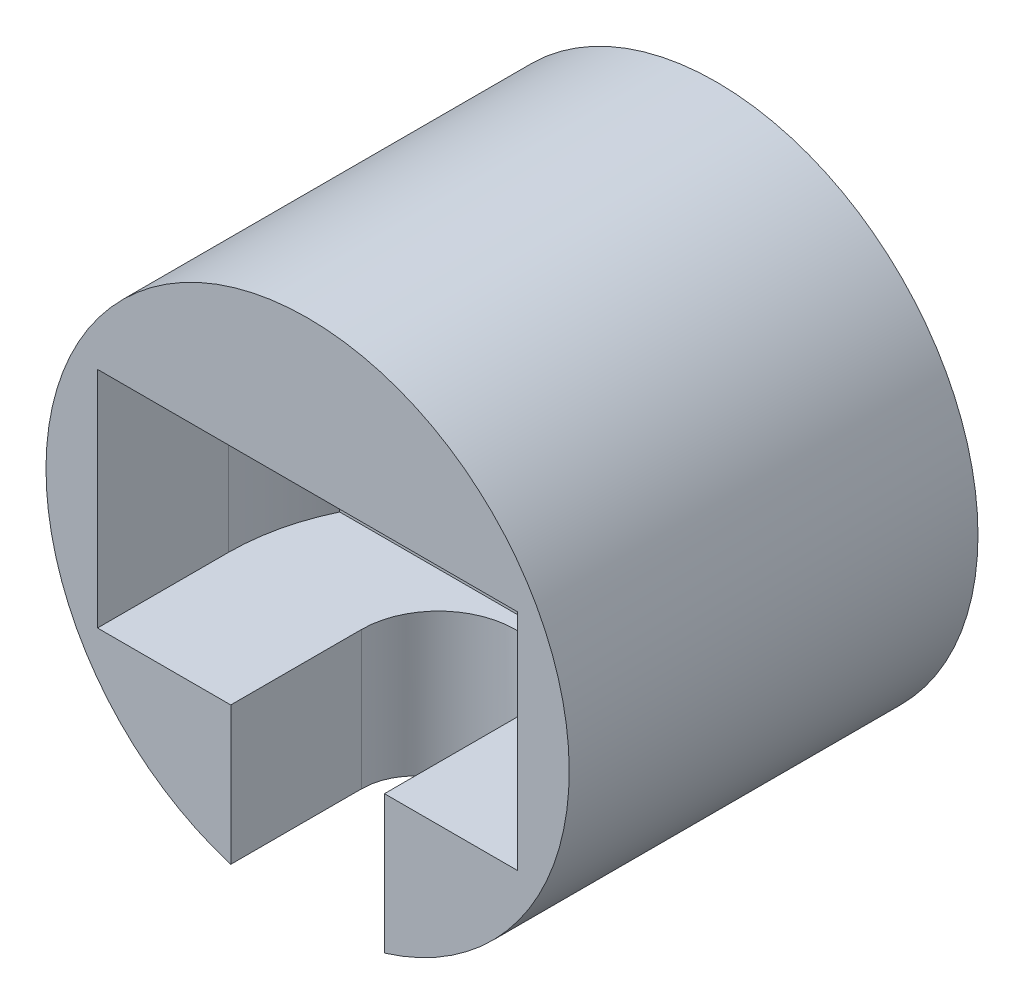
ISO-10303-21;
HEADER;
FILE_DESCRIPTION(('STEP AP214'),'2;1');
FILE_NAME('part.step','',(''),(''),'','','');
FILE_SCHEMA(('AUTOMOTIVE_DESIGN { 1 0 10303 214 1 1 1 1 }'));
ENDSEC;
DATA;
#1=APPLICATION_CONTEXT('core data for automotive mechanical design processes');
#2=APPLICATION_PROTOCOL_DEFINITION('international standard','automotive_design',2000,#1);
#3=PRODUCT_CONTEXT('',#1,'mechanical');
#4=PRODUCT('Part','Part','',(#3));
#5=PRODUCT_RELATED_PRODUCT_CATEGORY('part','',(#4));
#6=PRODUCT_DEFINITION_FORMATION('','',#4);
#7=PRODUCT_DEFINITION_CONTEXT('part definition',#1,'design');
#8=PRODUCT_DEFINITION('design','',#6,#7);
#9=PRODUCT_DEFINITION_SHAPE('','',#8);
#10=(LENGTH_UNIT() NAMED_UNIT(*) SI_UNIT(.MILLI.,.METRE.));
#11=(NAMED_UNIT(*) PLANE_ANGLE_UNIT() SI_UNIT($,.RADIAN.));
#12=(NAMED_UNIT(*) SI_UNIT($,.STERADIAN.) SOLID_ANGLE_UNIT());
#13=UNCERTAINTY_MEASURE_WITH_UNIT(LENGTH_MEASURE(1.E-05),#10,'distance_accuracy_value','');
#14=(GEOMETRIC_REPRESENTATION_CONTEXT(3) GLOBAL_UNCERTAINTY_ASSIGNED_CONTEXT((#13)) GLOBAL_UNIT_ASSIGNED_CONTEXT((#10,
#11,#12)) REPRESENTATION_CONTEXT('',''));
#15=CARTESIAN_POINT('',(0.,0.,0.));
#16=DIRECTION('',(0.,0.,1.));
#17=DIRECTION('',(1.,0.,0.));
#18=AXIS2_PLACEMENT_3D('',#15,#16,#17);
#19=CARTESIAN_POINT('',(0.,0.,25.));
#20=DIRECTION('',(0.,0.,1.));
#21=DIRECTION('',(1.,0.,0.));
#22=AXIS2_PLACEMENT_3D('',#19,#20,#21);
#23=PLANE('',#22);
#24=DIRECTION('',(0.,1.,0.));
#25=VECTOR('',#24,1.);
#26=CARTESIAN_POINT('',(4.7,-16.001,25.));
#27=LINE('',#26,#25);
#28=CARTESIAN_POINT('',(4.7,-15.2941165158371,25.));
#29=VERTEX_POINT('',#28);
#30=CARTESIAN_POINT('',(4.7,-6.85,25.));
#31=VERTEX_POINT('',#30);
#32=EDGE_CURVE('E128',#29,#31,#27,.T.);
#33=ORIENTED_EDGE('',*,*,#32,.F.);
#34=CARTESIAN_POINT('',(0.,0.,25.));
#35=DIRECTION('',(0.,0.,1.));
#36=DIRECTION('',(1.,0.,0.));
#37=AXIS2_PLACEMENT_3D('',#34,#35,#36);
#38=CIRCLE('',#37,16.);
#39=CARTESIAN_POINT('',(-4.7,-15.2941165158371,25.));
#40=VERTEX_POINT('',#39);
#41=EDGE_CURVE('E134',#29,#40,#38,.T.);
#42=ORIENTED_EDGE('',*,*,#41,.T.);
#43=DIRECTION('',(0.,1.,0.));
#44=VECTOR('',#43,1.);
#45=CARTESIAN_POINT('',(-4.7,-16.001,25.));
#46=LINE('',#45,#44);
#47=CARTESIAN_POINT('',(-4.7,-6.85,25.));
#48=VERTEX_POINT('',#47);
#49=EDGE_CURVE('E115',#40,#48,#46,.T.);
#50=ORIENTED_EDGE('',*,*,#49,.T.);
#51=DIRECTION('',(1.,0.,0.));
#52=VECTOR('',#51,1.);
#53=CARTESIAN_POINT('',(12.85,-6.85,25.));
#54=LINE('',#53,#52);
#55=CARTESIAN_POINT('',(-12.85,-6.85,25.));
#56=VERTEX_POINT('',#55);
#57=EDGE_CURVE('E168',#56,#48,#54,.T.);
#58=ORIENTED_EDGE('',*,*,#57,.F.);
#59=DIRECTION('',(0.,1.,0.));
#60=VECTOR('',#59,1.);
#61=CARTESIAN_POINT('',(-12.85,-6.85,25.));
#62=LINE('',#61,#60);
#63=CARTESIAN_POINT('',(-12.85,6.85,25.));
#64=VERTEX_POINT('',#63);
#65=EDGE_CURVE('E195',#56,#64,#62,.T.);
#66=ORIENTED_EDGE('',*,*,#65,.T.);
#67=DIRECTION('',(1.,0.,0.));
#68=VECTOR('',#67,1.);
#69=CARTESIAN_POINT('',(12.85,6.85,25.));
#70=LINE('',#69,#68);
#71=CARTESIAN_POINT('',(12.85,6.85,25.));
#72=VERTEX_POINT('',#71);
#73=EDGE_CURVE('E199',#64,#72,#70,.T.);
#74=ORIENTED_EDGE('',*,*,#73,.T.);
#75=DIRECTION('',(0.,1.,0.));
#76=VECTOR('',#75,1.);
#77=CARTESIAN_POINT('',(12.85,-6.85,25.));
#78=LINE('',#77,#76);
#79=CARTESIAN_POINT('',(12.85,-6.85,25.));
#80=VERTEX_POINT('',#79);
#81=EDGE_CURVE('E228',#80,#72,#78,.T.);
#82=ORIENTED_EDGE('',*,*,#81,.F.);
#83=EDGE_CURVE('E175',#31,#80,#54,.T.);
#84=ORIENTED_EDGE('',*,*,#83,.F.);
#85=EDGE_LOOP('',(#33,#42,#50,#58,#66,#74,#82,#84));
#86=FACE_BOUND('',#85,.T.);
#87=ADVANCED_FACE('F39',(#86),#23,.T.);
#88=CARTESIAN_POINT('',(0.,0.,0.));
#89=DIRECTION('',(0.,0.,1.));
#90=DIRECTION('',(1.,0.,0.));
#91=AXIS2_PLACEMENT_3D('',#88,#89,#90);
#92=PLANE('',#91);
#93=CARTESIAN_POINT('',(0.,0.,0.));
#94=DIRECTION('',(0.,0.,1.));
#95=DIRECTION('',(1.,0.,0.));
#96=AXIS2_PLACEMENT_3D('',#93,#94,#95);
#97=CIRCLE('',#96,16.);
#98=CARTESIAN_POINT('',(16.,0.,0.));
#99=VERTEX_POINT('',#98);
#100=EDGE_CURVE('E143',#99,#99,#97,.T.);
#101=ORIENTED_EDGE('',*,*,#100,.F.);
#102=EDGE_LOOP('',(#101));
#103=FACE_BOUND('',#102,.T.);
#104=CARTESIAN_POINT('',(0.,0.,0.));
#105=DIRECTION('',(0.,0.,1.));
#106=DIRECTION('',(1.,0.,0.));
#107=AXIS2_PLACEMENT_3D('',#104,#105,#106);
#108=CIRCLE('',#107,3.);
#109=CARTESIAN_POINT('',(3.,0.,0.));
#110=VERTEX_POINT('',#109);
#111=EDGE_CURVE('E149',#110,#110,#108,.T.);
#112=ORIENTED_EDGE('',*,*,#111,.T.);
#113=EDGE_LOOP('',(#112));
#114=FACE_BOUND('',#113,.T.);
#115=ADVANCED_FACE('F290',(#103,#114),#92,.F.);
#116=CARTESIAN_POINT('',(0.,0.,25.));
#117=DIRECTION('',(0.,0.,-1.));
#118=DIRECTION('',(-1.,0.,0.));
#119=AXIS2_PLACEMENT_3D('',#116,#117,#118);
#120=CYLINDRICAL_SURFACE('',#119,16.);
#121=ORIENTED_EDGE('',*,*,#41,.F.);
#122=DIRECTION('',(0.,0.,-1.));
#123=VECTOR('',#122,1.);
#124=CARTESIAN_POINT('',(4.7,-15.2941165158371,25.));
#125=LINE('',#124,#123);
#126=CARTESIAN_POINT('',(4.7,-15.2941165158371,17.));
#127=VERTEX_POINT('',#126);
#128=EDGE_CURVE('E138',#127,#29,#125,.F.);
#129=ORIENTED_EDGE('',*,*,#128,.F.);
#130=CARTESIAN_POINT('',(-4.7,-15.2941165158371,17.));
#131=CARTESIAN_POINT('',(-4.70001722579124,-15.2940984911914,16.8708763082752));
#132=CARTESIAN_POINT('',(-4.69467959532677,-15.2957511508983,16.7417593694433));
#133=CARTESIAN_POINT('',(-4.67342256857162,-15.3022661358053,16.484508204904));
#134=CARTESIAN_POINT('',(-4.6575054690734,-15.3071277643399,16.3563737720018));
#135=CARTESIAN_POINT('',(-4.61526925327359,-15.3199133773802,16.102312180988));
#136=CARTESIAN_POINT('',(-4.58897576774615,-15.3278298151223,15.9763803766041));
#137=CARTESIAN_POINT('',(-4.5262242254477,-15.3464774972835,15.7272901426551));
#138=CARTESIAN_POINT('',(-4.48976592026478,-15.3572088104933,15.6041317809481));
#139=CARTESIAN_POINT('',(-4.4070055073212,-15.3811622942011,15.3614888464773));
#140=CARTESIAN_POINT('',(-4.36070883811934,-15.3943830880787,15.2420022855742));
#141=CARTESIAN_POINT('',(-4.2586299224732,-15.4229334616981,15.0073978493071));
#142=CARTESIAN_POINT('',(-4.20284414826205,-15.4382638253089,14.8922816182415));
#143=CARTESIAN_POINT('',(-4.0218311511316,-15.4867850041534,14.5545989340589));
#144=CARTESIAN_POINT('',(-3.88289744008188,-15.5225213483323,14.3395503315135));
#145=CARTESIAN_POINT('',(-3.56816800393936,-15.5979162855502,13.9296838288117));
#146=CARTESIAN_POINT('',(-3.39146957040254,-15.6376553167489,13.7355784145308));
#147=CARTESIAN_POINT('',(-3.00808711855809,-15.7159038781299,13.3792437246022));
#148=CARTESIAN_POINT('',(-2.80139808669533,-15.754413201425,13.2170197893066));
#149=CARTESIAN_POINT('',(-2.35887540797605,-15.8267773011811,12.9260339930174));
#150=CARTESIAN_POINT('',(-2.12254676966987,-15.8605251272551,12.7979962986612));
#151=CARTESIAN_POINT('',(-1.63056291961247,-15.9186216161317,12.5837574944262));
#152=CARTESIAN_POINT('',(-1.37491254914412,-15.9429726241401,12.4975459444265));
#153=CARTESIAN_POINT('',(-0.858992820259393,-15.9789590165522,12.3717519184727));
#154=CARTESIAN_POINT('',(-0.599043601139717,-15.9909255320816,12.3309528304415));
#155=CARTESIAN_POINT('',(-0.0757272893159795,-16.0019593685531,12.2932973725569));
#156=CARTESIAN_POINT('',(0.187639177046514,-16.0010290208842,12.2964330605367));
#157=CARTESIAN_POINT('',(0.701781987076623,-15.986609052891,12.3457363968185));
#158=CARTESIAN_POINT('',(0.952697149021009,-15.9735040204677,12.3905863762989));
#159=CARTESIAN_POINT('',(1.44326434772073,-15.936672546209,12.5198939164618));
#160=CARTESIAN_POINT('',(1.68291580259772,-15.9129455563127,12.6043535208919));
#161=CARTESIAN_POINT('',(2.14734195764715,-15.8569951667603,12.8114089637335));
#162=CARTESIAN_POINT('',(2.3719168890139,-15.8246783717435,12.9344268485726));
#163=CARTESIAN_POINT('',(2.79764060073814,-15.7549934982056,13.2147339994));
#164=CARTESIAN_POINT('',(2.99878433364763,-15.7176243350571,13.3720306286955));
#165=CARTESIAN_POINT('',(3.37988171524785,-15.6401924120016,13.7234273838237));
#166=CARTESIAN_POINT('',(3.55877859476659,-15.6000811423672,13.9186720640302));
#167=CARTESIAN_POINT('',(3.8007739519457,-15.5422339151979,14.23203561699));
#168=CARTESIAN_POINT('',(3.87709053299929,-15.523325993261,14.3399870129123));
#169=CARTESIAN_POINT('',(4.02044411990821,-15.4868166445026,14.5620774806235));
#170=CARTESIAN_POINT('',(4.08748474023833,-15.4692147100364,14.6762141180049));
#171=CARTESIAN_POINT('',(4.21240211941698,-15.435669671594,14.9110905645856));
#172=CARTESIAN_POINT('',(4.2701822732532,-15.4197445836125,15.0318842732742));
#173=CARTESIAN_POINT('',(4.37529241280977,-15.3902500196851,15.2781607867937));
#174=CARTESIAN_POINT('',(4.42262665920372,-15.376679583809,15.4036416553175));
#175=CARTESIAN_POINT('',(4.50641708325566,-15.3523324055034,15.658301526974));
#176=CARTESIAN_POINT('',(4.54288467377239,-15.3415527336072,15.7874764928894));
#177=CARTESIAN_POINT('',(4.60466012124381,-15.3231244085038,16.0486325143976));
#178=CARTESIAN_POINT('',(4.62997313556818,-15.3154743084421,16.1806122435452));
#179=CARTESIAN_POINT('',(4.66636734396713,-15.3044221302613,16.4271110694695));
#180=CARTESIAN_POINT('',(4.67898025459734,-15.3005648413854,16.5413861511911));
#181=CARTESIAN_POINT('',(4.69579514378742,-15.2954085279916,16.7704378623983));
#182=CARTESIAN_POINT('',(4.70000970338143,-15.2941056768805,16.8852134831475));
#183=CARTESIAN_POINT('',(4.7,-15.2941165158371,17.));
#184=B_SPLINE_CURVE_WITH_KNOTS('',3,(#130,#131,#132,#133,#134,#135,#136,#137,#138,#139,#140,
#141,#142,#143,#144,#145,#146,#147,#148,#149,#150,#151,#152,#153,#154,#155,#156,#157,#158,#159,
#160,#161,#162,#163,#164,#165,#166,#167,#168,#169,#170,#171,#172,#173,#174,#175,#176,#177,#178,
#179,#180,#181,#182,#183),.UNSPECIFIED.,.F.,.F.,(4,2,2,2,2,2,2,2,2,2,2,2,2,2,2,2,2,2,2,2,2,2,2,
2,2,2,4),(0.,0.387239730218642,0.77439541851616,1.1606007175409,1.54681545563184,
1.93281725049951,2.31896286425264,3.09078761057912,3.88368109944087,4.67670729005339,
5.48539601040462,6.29388277197121,7.08014560456739,7.86626630488029,8.62836891009986,
9.39051084204202,10.1613047782044,10.9322644496304,11.7316934059132,12.1319552872169,
12.532060760407,12.9361010335717,13.3399762010621,13.743425685675,14.1466884373397,
14.4914600193035,14.8357147315061),.UNSPECIFIED.);
#185=CARTESIAN_POINT('',(-4.7,-15.2941165158371,17.));
#186=VERTEX_POINT('',#185);
#187=EDGE_CURVE('E127',#186,#127,#184,.T.);
#188=ORIENTED_EDGE('',*,*,#187,.F.);
#189=DIRECTION('',(0.,0.,-1.));
#190=VECTOR('',#189,1.);
#191=CARTESIAN_POINT('',(-4.7,-15.2941165158371,25.));
#192=LINE('',#191,#190);
#193=EDGE_CURVE('E118',#40,#186,#192,.T.);
#194=ORIENTED_EDGE('',*,*,#193,.F.);
#195=EDGE_LOOP('',(#121,#129,#188,#194));
#196=FACE_BOUND('',#195,.T.);
#197=ORIENTED_EDGE('',*,*,#100,.T.);
#198=EDGE_LOOP('',(#197));
#199=FACE_BOUND('',#198,.T.);
#200=ADVANCED_FACE('F41',(#196,#199),#120,.T.);
#201=CARTESIAN_POINT('',(0.,0.,25.));
#202=DIRECTION('',(0.,0.,-1.));
#203=DIRECTION('',(-1.,0.,0.));
#204=AXIS2_PLACEMENT_3D('',#201,#202,#203);
#205=CYLINDRICAL_SURFACE('',#204,3.);
#206=CARTESIAN_POINT('',(0.,0.,11.45));
#207=DIRECTION('',(0.,0.,-1.));
#208=DIRECTION('',(-1.,0.,0.));
#209=AXIS2_PLACEMENT_3D('',#206,#207,#208);
#210=CIRCLE('',#209,3.);
#211=CARTESIAN_POINT('',(-3.,0.,11.45));
#212=VERTEX_POINT('',#211);
#213=EDGE_CURVE('E154',#212,#212,#210,.T.);
#214=ORIENTED_EDGE('',*,*,#213,.F.);
#215=EDGE_LOOP('',(#214));
#216=FACE_BOUND('',#215,.T.);
#217=ORIENTED_EDGE('',*,*,#111,.F.);
#218=EDGE_LOOP('',(#217));
#219=FACE_BOUND('',#218,.T.);
#220=ADVANCED_FACE('F285',(#216,#219),#205,.F.);
#221=CARTESIAN_POINT('',(-12.85,-6.85,25.));
#222=DIRECTION('',(-1.,0.,0.));
#223=DIRECTION('',(0.,0.,1.));
#224=AXIS2_PLACEMENT_3D('',#221,#222,#223);
#225=PLANE('',#224);
#226=DIRECTION('',(0.,0.,1.));
#227=VECTOR('',#226,1.);
#228=CARTESIAN_POINT('',(-12.85,6.85,25.));
#229=LINE('',#228,#227);
#230=CARTESIAN_POINT('',(-12.85,6.85,17.));
#231=VERTEX_POINT('',#230);
#232=EDGE_CURVE('E137',#231,#64,#229,.T.);
#233=ORIENTED_EDGE('',*,*,#232,.T.);
#234=ORIENTED_EDGE('',*,*,#65,.F.);
#235=DIRECTION('',(0.,0.,1.));
#236=VECTOR('',#235,1.);
#237=CARTESIAN_POINT('',(-12.85,-6.85,25.));
#238=LINE('',#237,#236);
#239=CARTESIAN_POINT('',(-12.85,-6.85,17.));
#240=VERTEX_POINT('',#239);
#241=EDGE_CURVE('E171',#240,#56,#238,.T.);
#242=ORIENTED_EDGE('',*,*,#241,.F.);
#243=DIRECTION('',(0.,1.,0.));
#244=VECTOR('',#243,1.);
#245=CARTESIAN_POINT('',(-12.85,-6.85,17.));
#246=LINE('',#245,#244);
#247=EDGE_CURVE('E157',#240,#231,#246,.T.);
#248=ORIENTED_EDGE('',*,*,#247,.T.);
#249=EDGE_LOOP('',(#233,#234,#242,#248));
#250=FACE_BOUND('',#249,.T.);
#251=ADVANCED_FACE('F233',(#250),#225,.F.);
#252=CARTESIAN_POINT('',(0.,-6.85,17.));
#253=DIRECTION('',(0.,1.,0.));
#254=DIRECTION('',(0.,0.,1.));
#255=AXIS2_PLACEMENT_3D('',#252,#253,#254);
#256=CYLINDRICAL_SURFACE('',#255,12.85);
#257=CARTESIAN_POINT('',(0.,6.85,17.));
#258=DIRECTION('',(0.,1.,0.));
#259=DIRECTION('',(0.,0.,1.));
#260=AXIS2_PLACEMENT_3D('',#257,#258,#259);
#261=CIRCLE('',#260,12.85);
#262=CARTESIAN_POINT('',(-11.5896505555603,6.85,11.45));
#263=VERTEX_POINT('',#262);
#264=EDGE_CURVE('E213',#263,#231,#261,.T.);
#265=ORIENTED_EDGE('',*,*,#264,.T.);
#266=ORIENTED_EDGE('',*,*,#247,.F.);
#267=CARTESIAN_POINT('',(0.,-6.85,17.));
#268=DIRECTION('',(0.,1.,0.));
#269=DIRECTION('',(0.,0.,1.));
#270=AXIS2_PLACEMENT_3D('',#267,#268,#269);
#271=CIRCLE('',#270,12.85);
#272=CARTESIAN_POINT('',(-11.5896505555603,-6.85,11.45));
#273=VERTEX_POINT('',#272);
#274=EDGE_CURVE('E192',#273,#240,#271,.T.);
#275=ORIENTED_EDGE('',*,*,#274,.F.);
#276=DIRECTION('',(0.,1.,0.));
#277=VECTOR('',#276,1.);
#278=CARTESIAN_POINT('',(-11.5896505555603,-6.85,11.45));
#279=LINE('',#278,#277);
#280=EDGE_CURVE('E219',#273,#263,#279,.T.);
#281=ORIENTED_EDGE('',*,*,#280,.T.);
#282=EDGE_LOOP('',(#265,#266,#275,#281));
#283=FACE_BOUND('',#282,.T.);
#284=ADVANCED_FACE('F239',(#283),#256,.F.);
#285=CARTESIAN_POINT('',(-11.5896505555603,-6.85,11.45));
#286=DIRECTION('',(0.,0.,-1.));
#287=DIRECTION('',(-1.,0.,0.));
#288=AXIS2_PLACEMENT_3D('',#285,#286,#287);
#289=PLANE('',#288);
#290=ORIENTED_EDGE('',*,*,#213,.T.);
#291=EDGE_LOOP('',(#290));
#292=FACE_BOUND('',#291,.T.);
#293=DIRECTION('',(-1.,0.,0.));
#294=VECTOR('',#293,1.);
#295=CARTESIAN_POINT('',(-11.5896505555603,6.85,11.45));
#296=LINE('',#295,#294);
#297=CARTESIAN_POINT('',(11.5896505555603,6.85,11.45));
#298=VERTEX_POINT('',#297);
#299=EDGE_CURVE('E209',#298,#263,#296,.T.);
#300=ORIENTED_EDGE('',*,*,#299,.T.);
#301=ORIENTED_EDGE('',*,*,#280,.F.);
#302=DIRECTION('',(-1.,0.,0.));
#303=VECTOR('',#302,1.);
#304=CARTESIAN_POINT('',(-11.5896505555603,-6.85,11.45));
#305=LINE('',#304,#303);
#306=CARTESIAN_POINT('',(11.5896505555603,-6.85,11.45));
#307=VERTEX_POINT('',#306);
#308=EDGE_CURVE('E188',#307,#273,#305,.T.);
#309=ORIENTED_EDGE('',*,*,#308,.F.);
#310=DIRECTION('',(0.,1.,0.));
#311=VECTOR('',#310,1.);
#312=CARTESIAN_POINT('',(11.5896505555603,-6.85,11.45));
#313=LINE('',#312,#311);
#314=EDGE_CURVE('E222',#307,#298,#313,.T.);
#315=ORIENTED_EDGE('',*,*,#314,.T.);
#316=EDGE_LOOP('',(#300,#301,#309,#315));
#317=FACE_BOUND('',#316,.T.);
#318=ADVANCED_FACE('F243',(#292,#317),#289,.F.);
#319=CARTESIAN_POINT('',(0.,-6.85,17.));
#320=DIRECTION('',(0.,1.,0.));
#321=DIRECTION('',(0.,0.,1.));
#322=AXIS2_PLACEMENT_3D('',#319,#320,#321);
#323=CYLINDRICAL_SURFACE('',#322,12.85);
#324=CARTESIAN_POINT('',(0.,6.85,17.));
#325=DIRECTION('',(0.,1.,0.));
#326=DIRECTION('',(0.,0.,1.));
#327=AXIS2_PLACEMENT_3D('',#324,#325,#326);
#328=CIRCLE('',#327,12.85);
#329=CARTESIAN_POINT('',(12.85,6.85,17.));
#330=VERTEX_POINT('',#329);
#331=EDGE_CURVE('E205',#330,#298,#328,.T.);
#332=ORIENTED_EDGE('',*,*,#331,.T.);
#333=ORIENTED_EDGE('',*,*,#314,.F.);
#334=CARTESIAN_POINT('',(0.,-6.85,17.));
#335=DIRECTION('',(0.,1.,0.));
#336=DIRECTION('',(0.,0.,1.));
#337=AXIS2_PLACEMENT_3D('',#334,#335,#336);
#338=CIRCLE('',#337,12.85);
#339=CARTESIAN_POINT('',(12.85,-6.85,17.));
#340=VERTEX_POINT('',#339);
#341=EDGE_CURVE('E180',#340,#307,#338,.T.);
#342=ORIENTED_EDGE('',*,*,#341,.F.);
#343=DIRECTION('',(0.,1.,0.));
#344=VECTOR('',#343,1.);
#345=CARTESIAN_POINT('',(12.85,-6.85,17.));
#346=LINE('',#345,#344);
#347=EDGE_CURVE('E225',#340,#330,#346,.T.);
#348=ORIENTED_EDGE('',*,*,#347,.T.);
#349=EDGE_LOOP('',(#332,#333,#342,#348));
#350=FACE_BOUND('',#349,.T.);
#351=ADVANCED_FACE('F245',(#350),#323,.F.);
#352=CARTESIAN_POINT('',(12.85,-6.85,25.));
#353=DIRECTION('',(1.,0.,0.));
#354=DIRECTION('',(0.,0.,-1.));
#355=AXIS2_PLACEMENT_3D('',#352,#353,#354);
#356=PLANE('',#355);
#357=DIRECTION('',(0.,0.,-1.));
#358=VECTOR('',#357,1.);
#359=CARTESIAN_POINT('',(12.85,6.85,25.));
#360=LINE('',#359,#358);
#361=EDGE_CURVE('E63',#72,#330,#360,.T.);
#362=ORIENTED_EDGE('',*,*,#361,.T.);
#363=ORIENTED_EDGE('',*,*,#347,.F.);
#364=DIRECTION('',(0.,0.,-1.));
#365=VECTOR('',#364,1.);
#366=CARTESIAN_POINT('',(12.85,-6.85,25.));
#367=LINE('',#366,#365);
#368=EDGE_CURVE('E174',#80,#340,#367,.T.);
#369=ORIENTED_EDGE('',*,*,#368,.F.);
#370=ORIENTED_EDGE('',*,*,#81,.T.);
#371=EDGE_LOOP('',(#362,#363,#369,#370));
#372=FACE_BOUND('',#371,.T.);
#373=ADVANCED_FACE('F249',(#372),#356,.F.);
#374=CARTESIAN_POINT('',(0.,-6.85,17.));
#375=DIRECTION('',(0.,1.,0.));
#376=DIRECTION('',(0.,0.,1.));
#377=AXIS2_PLACEMENT_3D('',#374,#375,#376);
#378=PLANE('',#377);
#379=DIRECTION('',(0.,0.,-1.));
#380=VECTOR('',#379,1.);
#381=CARTESIAN_POINT('',(4.7,-6.85,17.));
#382=LINE('',#381,#380);
#383=CARTESIAN_POINT('',(4.7,-6.85,17.));
#384=VERTEX_POINT('',#383);
#385=EDGE_CURVE('E11',#31,#384,#382,.T.);
#386=ORIENTED_EDGE('',*,*,#385,.F.);
#387=ORIENTED_EDGE('',*,*,#83,.T.);
#388=ORIENTED_EDGE('',*,*,#368,.T.);
#389=ORIENTED_EDGE('',*,*,#341,.T.);
#390=ORIENTED_EDGE('',*,*,#308,.T.);
#391=ORIENTED_EDGE('',*,*,#274,.T.);
#392=ORIENTED_EDGE('',*,*,#241,.T.);
#393=ORIENTED_EDGE('',*,*,#57,.T.);
#394=DIRECTION('',(0.,0.,1.));
#395=VECTOR('',#394,1.);
#396=CARTESIAN_POINT('',(-4.7,-6.85,17.));
#397=LINE('',#396,#395);
#398=CARTESIAN_POINT('',(-4.7,-6.85,17.));
#399=VERTEX_POINT('',#398);
#400=EDGE_CURVE('E121',#399,#48,#397,.T.);
#401=ORIENTED_EDGE('',*,*,#400,.F.);
#402=CARTESIAN_POINT('',(0.,-6.85,17.));
#403=DIRECTION('',(0.,1.,0.));
#404=DIRECTION('',(0.,0.,1.));
#405=AXIS2_PLACEMENT_3D('',#402,#403,#404);
#406=CIRCLE('',#405,4.7);
#407=EDGE_CURVE('E48',#384,#399,#406,.T.);
#408=ORIENTED_EDGE('',*,*,#407,.F.);
#409=EDGE_LOOP('',(#386,#387,#388,#389,#390,#391,#392,#393,#401,#408));
#410=FACE_BOUND('',#409,.T.);
#411=ADVANCED_FACE('F166',(#410),#378,.T.);
#412=CARTESIAN_POINT('',(0.,6.85,17.));
#413=DIRECTION('',(0.,1.,0.));
#414=DIRECTION('',(0.,0.,1.));
#415=AXIS2_PLACEMENT_3D('',#412,#413,#414);
#416=PLANE('',#415);
#417=ORIENTED_EDGE('',*,*,#232,.F.);
#418=ORIENTED_EDGE('',*,*,#264,.F.);
#419=ORIENTED_EDGE('',*,*,#299,.F.);
#420=ORIENTED_EDGE('',*,*,#331,.F.);
#421=ORIENTED_EDGE('',*,*,#361,.F.);
#422=ORIENTED_EDGE('',*,*,#73,.F.);
#423=EDGE_LOOP('',(#417,#418,#419,#420,#421,#422));
#424=FACE_BOUND('',#423,.T.);
#425=ADVANCED_FACE('F236',(#424),#416,.F.);
#426=CARTESIAN_POINT('',(0.,-16.001,17.));
#427=DIRECTION('',(0.,1.,0.));
#428=DIRECTION('',(0.,0.,1.));
#429=AXIS2_PLACEMENT_3D('',#426,#427,#428);
#430=CYLINDRICAL_SURFACE('',#429,4.7);
#431=ORIENTED_EDGE('',*,*,#407,.T.);
#432=DIRECTION('',(0.,1.,0.));
#433=VECTOR('',#432,1.);
#434=CARTESIAN_POINT('',(-4.7,-16.001,17.));
#435=LINE('',#434,#433);
#436=EDGE_CURVE('E55',#186,#399,#435,.T.);
#437=ORIENTED_EDGE('',*,*,#436,.F.);
#438=ORIENTED_EDGE('',*,*,#187,.T.);
#439=DIRECTION('',(0.,1.,0.));
#440=VECTOR('',#439,1.);
#441=CARTESIAN_POINT('',(4.7,-16.001,17.));
#442=LINE('',#441,#440);
#443=EDGE_CURVE('E163',#127,#384,#442,.T.);
#444=ORIENTED_EDGE('',*,*,#443,.T.);
#445=EDGE_LOOP('',(#431,#437,#438,#444));
#446=FACE_BOUND('',#445,.T.);
#447=ADVANCED_FACE('F162',(#446),#430,.F.);
#448=CARTESIAN_POINT('',(4.7,-16.001,17.));
#449=DIRECTION('',(1.,0.,0.));
#450=DIRECTION('',(0.,0.,-1.));
#451=AXIS2_PLACEMENT_3D('',#448,#449,#450);
#452=PLANE('',#451);
#453=ORIENTED_EDGE('',*,*,#385,.T.);
#454=ORIENTED_EDGE('',*,*,#443,.F.);
#455=ORIENTED_EDGE('',*,*,#128,.T.);
#456=ORIENTED_EDGE('',*,*,#32,.T.);
#457=EDGE_LOOP('',(#453,#454,#455,#456));
#458=FACE_BOUND('',#457,.T.);
#459=ADVANCED_FACE('F251',(#458),#452,.F.);
#460=CARTESIAN_POINT('',(-4.7,-16.001,17.));
#461=DIRECTION('',(-1.,0.,0.));
#462=DIRECTION('',(0.,0.,1.));
#463=AXIS2_PLACEMENT_3D('',#460,#461,#462);
#464=PLANE('',#463);
#465=ORIENTED_EDGE('',*,*,#400,.T.);
#466=ORIENTED_EDGE('',*,*,#49,.F.);
#467=ORIENTED_EDGE('',*,*,#193,.T.);
#468=ORIENTED_EDGE('',*,*,#436,.T.);
#469=EDGE_LOOP('',(#465,#466,#467,#468));
#470=FACE_BOUND('',#469,.T.);
#471=ADVANCED_FACE('F117',(#470),#464,.F.);
#472=CLOSED_SHELL('',(#87,#115,#200,#220,#251,#284,#318,#351,#373,#411,#425,#447,#459,#471));
#473=MANIFOLD_SOLID_BREP('B2',#472);
#474=ADVANCED_BREP_SHAPE_REPRESENTATION('',(#18,#473),#14);
#475=SHAPE_DEFINITION_REPRESENTATION(#9,#474);
ENDSEC;
END-ISO-10303-21;
